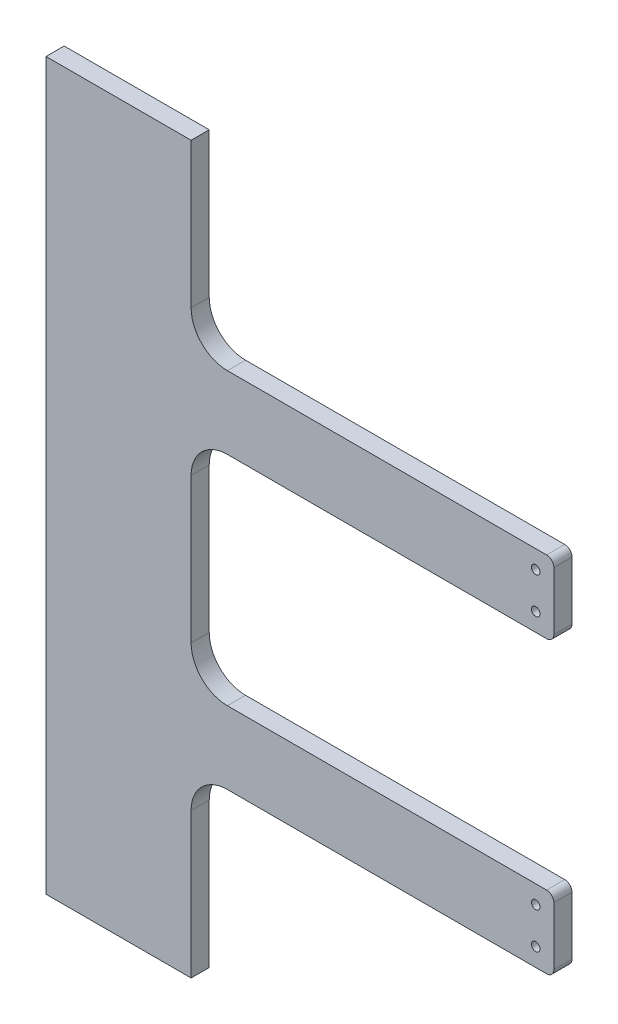
ISO-10303-21;
HEADER;
FILE_DESCRIPTION(('STEP AP214'),'2;1');
FILE_NAME('part.step','',(''),(''),'','','');
FILE_SCHEMA(('AUTOMOTIVE_DESIGN { 1 0 10303 214 1 1 1 1 }'));
ENDSEC;
DATA;
#1=APPLICATION_CONTEXT('core data for automotive mechanical design processes');
#2=APPLICATION_PROTOCOL_DEFINITION('international standard','automotive_design',2000,#1);
#3=PRODUCT_CONTEXT('',#1,'mechanical');
#4=PRODUCT('Part','Part','',(#3));
#5=PRODUCT_RELATED_PRODUCT_CATEGORY('part','',(#4));
#6=PRODUCT_DEFINITION_FORMATION('','',#4);
#7=PRODUCT_DEFINITION_CONTEXT('part definition',#1,'design');
#8=PRODUCT_DEFINITION('design','',#6,#7);
#9=PRODUCT_DEFINITION_SHAPE('','',#8);
#10=(LENGTH_UNIT() NAMED_UNIT(*) SI_UNIT(.MILLI.,.METRE.));
#11=(NAMED_UNIT(*) PLANE_ANGLE_UNIT() SI_UNIT($,.RADIAN.));
#12=(NAMED_UNIT(*) SI_UNIT($,.STERADIAN.) SOLID_ANGLE_UNIT());
#13=UNCERTAINTY_MEASURE_WITH_UNIT(LENGTH_MEASURE(1.E-05),#10,'distance_accuracy_value','');
#14=(GEOMETRIC_REPRESENTATION_CONTEXT(3) GLOBAL_UNCERTAINTY_ASSIGNED_CONTEXT((#13)) GLOBAL_UNIT_ASSIGNED_CONTEXT((#10,
#11,#12)) REPRESENTATION_CONTEXT('',''));
#15=CARTESIAN_POINT('',(0.,0.,0.));
#16=DIRECTION('',(0.,0.,1.));
#17=DIRECTION('',(1.,0.,0.));
#18=AXIS2_PLACEMENT_3D('',#15,#16,#17);
#19=CARTESIAN_POINT('',(25.4,127.,6.35));
#20=DIRECTION('',(-1.,0.,0.));
#21=DIRECTION('',(0.,-1.,0.));
#22=AXIS2_PLACEMENT_3D('',#19,#20,#21);
#23=PLANE('',#22);
#24=DIRECTION('',(0.,1.,0.));
#25=VECTOR('',#24,1.);
#26=CARTESIAN_POINT('',(25.4,127.,6.35));
#27=LINE('',#26,#25);
#28=CARTESIAN_POINT('',(25.4,76.2,6.35));
#29=VERTEX_POINT('',#28);
#30=CARTESIAN_POINT('',(25.4,127.,6.35));
#31=VERTEX_POINT('',#30);
#32=EDGE_CURVE('E180',#29,#31,#27,.T.);
#33=ORIENTED_EDGE('',*,*,#32,.F.);
#34=DIRECTION('',(0.,0.,1.));
#35=VECTOR('',#34,1.);
#36=CARTESIAN_POINT('',(25.4,76.2,6.35));
#37=LINE('',#36,#35);
#38=CARTESIAN_POINT('',(25.4,76.2,0.));
#39=VERTEX_POINT('',#38);
#40=EDGE_CURVE('E238',#29,#39,#37,.F.);
#41=ORIENTED_EDGE('',*,*,#40,.T.);
#42=DIRECTION('',(0.,1.,0.));
#43=VECTOR('',#42,1.);
#44=CARTESIAN_POINT('',(25.4,127.,0.));
#45=LINE('',#44,#43);
#46=CARTESIAN_POINT('',(25.4,127.,0.));
#47=VERTEX_POINT('',#46);
#48=EDGE_CURVE('E207',#39,#47,#45,.T.);
#49=ORIENTED_EDGE('',*,*,#48,.T.);
#50=DIRECTION('',(0.,0.,-1.));
#51=VECTOR('',#50,1.);
#52=CARTESIAN_POINT('',(25.4,127.,6.35));
#53=LINE('',#52,#51);
#54=EDGE_CURVE('E199',#31,#47,#53,.T.);
#55=ORIENTED_EDGE('',*,*,#54,.F.);
#56=EDGE_LOOP('',(#33,#41,#49,#55));
#57=FACE_BOUND('',#56,.T.);
#58=ADVANCED_FACE('F41',(#57),#23,.F.);
#59=CARTESIAN_POINT('',(25.4,-25.4,6.35));
#60=VERTEX_POINT('',#59);
#61=CARTESIAN_POINT('',(25.4,25.4,6.35));
#62=VERTEX_POINT('',#61);
#63=EDGE_CURVE('E192',#60,#62,#27,.T.);
#64=ORIENTED_EDGE('',*,*,#63,.F.);
#65=DIRECTION('',(0.,0.,1.));
#66=VECTOR('',#65,1.);
#67=CARTESIAN_POINT('',(25.4,-25.4,6.35));
#68=LINE('',#67,#66);
#69=CARTESIAN_POINT('',(25.4,-25.4,0.));
#70=VERTEX_POINT('',#69);
#71=EDGE_CURVE('E231',#60,#70,#68,.F.);
#72=ORIENTED_EDGE('',*,*,#71,.T.);
#73=CARTESIAN_POINT('',(25.4,25.4,0.));
#74=VERTEX_POINT('',#73);
#75=EDGE_CURVE('E359',#70,#74,#45,.T.);
#76=ORIENTED_EDGE('',*,*,#75,.T.);
#77=DIRECTION('',(0.,0.,1.));
#78=VECTOR('',#77,1.);
#79=CARTESIAN_POINT('',(25.4,25.4,6.35));
#80=LINE('',#79,#78);
#81=EDGE_CURVE('E227',#74,#62,#80,.T.);
#82=ORIENTED_EDGE('',*,*,#81,.T.);
#83=EDGE_LOOP('',(#64,#72,#76,#82));
#84=FACE_BOUND('',#83,.T.);
#85=ADVANCED_FACE('F483',(#84),#23,.F.);
#86=CARTESIAN_POINT('',(25.4,-127.,0.));
#87=VERTEX_POINT('',#86);
#88=CARTESIAN_POINT('',(25.4,-76.2,0.));
#89=VERTEX_POINT('',#88);
#90=EDGE_CURVE('E354',#87,#89,#45,.T.);
#91=ORIENTED_EDGE('',*,*,#90,.T.);
#92=DIRECTION('',(0.,0.,1.));
#93=VECTOR('',#92,1.);
#94=CARTESIAN_POINT('',(25.4,-76.2,6.35));
#95=LINE('',#94,#93);
#96=CARTESIAN_POINT('',(25.4,-76.2,6.35));
#97=VERTEX_POINT('',#96);
#98=EDGE_CURVE('E210',#89,#97,#95,.T.);
#99=ORIENTED_EDGE('',*,*,#98,.T.);
#100=CARTESIAN_POINT('',(25.4,-127.,6.35));
#101=VERTEX_POINT('',#100);
#102=EDGE_CURVE('E195',#101,#97,#27,.T.);
#103=ORIENTED_EDGE('',*,*,#102,.F.);
#104=DIRECTION('',(0.,0.,-1.));
#105=VECTOR('',#104,1.);
#106=CARTESIAN_POINT('',(25.4,-127.,6.35));
#107=LINE('',#106,#105);
#108=EDGE_CURVE('E353',#101,#87,#107,.T.);
#109=ORIENTED_EDGE('',*,*,#108,.T.);
#110=EDGE_LOOP('',(#91,#99,#103,#109));
#111=FACE_BOUND('',#110,.T.);
#112=ADVANCED_FACE('F383',(#111),#23,.F.);
#113=CARTESIAN_POINT('',(-25.4,127.,6.35));
#114=DIRECTION('',(0.,-1.,0.));
#115=DIRECTION('',(0.,0.,-1.));
#116=AXIS2_PLACEMENT_3D('',#113,#114,#115);
#117=PLANE('',#116);
#118=DIRECTION('',(-1.,0.,0.));
#119=VECTOR('',#118,1.);
#120=CARTESIAN_POINT('',(-25.4,127.,0.));
#121=LINE('',#120,#119);
#122=CARTESIAN_POINT('',(-25.4,127.,0.));
#123=VERTEX_POINT('',#122);
#124=EDGE_CURVE('E358',#47,#123,#121,.T.);
#125=ORIENTED_EDGE('',*,*,#124,.T.);
#126=DIRECTION('',(0.,0.,-1.));
#127=VECTOR('',#126,1.);
#128=CARTESIAN_POINT('',(-25.4,127.,6.35));
#129=LINE('',#128,#127);
#130=CARTESIAN_POINT('',(-25.4,127.,6.35));
#131=VERTEX_POINT('',#130);
#132=EDGE_CURVE('E201',#131,#123,#129,.T.);
#133=ORIENTED_EDGE('',*,*,#132,.F.);
#134=DIRECTION('',(-1.,0.,0.));
#135=VECTOR('',#134,1.);
#136=CARTESIAN_POINT('',(-25.4,127.,6.35));
#137=LINE('',#136,#135);
#138=EDGE_CURVE('E184',#31,#131,#137,.T.);
#139=ORIENTED_EDGE('',*,*,#138,.F.);
#140=ORIENTED_EDGE('',*,*,#54,.T.);
#141=EDGE_LOOP('',(#125,#133,#139,#140));
#142=FACE_BOUND('',#141,.T.);
#143=ADVANCED_FACE('F198',(#142),#117,.F.);
#144=CARTESIAN_POINT('',(-25.4,127.,6.35));
#145=DIRECTION('',(1.,0.,0.));
#146=DIRECTION('',(0.,1.,0.));
#147=AXIS2_PLACEMENT_3D('',#144,#145,#146);
#148=PLANE('',#147);
#149=DIRECTION('',(0.,-1.,0.));
#150=VECTOR('',#149,1.);
#151=CARTESIAN_POINT('',(-25.4,127.,0.));
#152=LINE('',#151,#150);
#153=CARTESIAN_POINT('',(-25.4,-127.,0.));
#154=VERTEX_POINT('',#153);
#155=EDGE_CURVE('E362',#123,#154,#152,.T.);
#156=ORIENTED_EDGE('',*,*,#155,.T.);
#157=DIRECTION('',(0.,0.,-1.));
#158=VECTOR('',#157,1.);
#159=CARTESIAN_POINT('',(-25.4,-127.,6.35));
#160=LINE('',#159,#158);
#161=CARTESIAN_POINT('',(-25.4,-127.,6.35));
#162=VERTEX_POINT('',#161);
#163=EDGE_CURVE('E217',#162,#154,#160,.T.);
#164=ORIENTED_EDGE('',*,*,#163,.F.);
#165=DIRECTION('',(0.,-1.,0.));
#166=VECTOR('',#165,1.);
#167=CARTESIAN_POINT('',(-25.4,127.,6.35));
#168=LINE('',#167,#166);
#169=EDGE_CURVE('E204',#131,#162,#168,.T.);
#170=ORIENTED_EDGE('',*,*,#169,.F.);
#171=ORIENTED_EDGE('',*,*,#132,.T.);
#172=EDGE_LOOP('',(#156,#164,#170,#171));
#173=FACE_BOUND('',#172,.T.);
#174=ADVANCED_FACE('F497',(#173),#148,.F.);
#175=CARTESIAN_POINT('',(-25.4,-127.,6.35));
#176=DIRECTION('',(0.,1.,0.));
#177=DIRECTION('',(0.,0.,1.));
#178=AXIS2_PLACEMENT_3D('',#175,#176,#177);
#179=PLANE('',#178);
#180=DIRECTION('',(1.,0.,0.));
#181=VECTOR('',#180,1.);
#182=CARTESIAN_POINT('',(-25.4,-127.,0.));
#183=LINE('',#182,#181);
#184=EDGE_CURVE('E193',#154,#87,#183,.T.);
#185=ORIENTED_EDGE('',*,*,#184,.T.);
#186=ORIENTED_EDGE('',*,*,#108,.F.);
#187=DIRECTION('',(1.,0.,0.));
#188=VECTOR('',#187,1.);
#189=CARTESIAN_POINT('',(-25.4,-127.,6.35));
#190=LINE('',#189,#188);
#191=EDGE_CURVE('E350',#162,#101,#190,.T.);
#192=ORIENTED_EDGE('',*,*,#191,.F.);
#193=ORIENTED_EDGE('',*,*,#163,.T.);
#194=EDGE_LOOP('',(#185,#186,#192,#193));
#195=FACE_BOUND('',#194,.T.);
#196=ADVANCED_FACE('F375',(#195),#179,.F.);
#197=CARTESIAN_POINT('',(0.,0.,6.35));
#198=DIRECTION('',(0.,0.,1.));
#199=DIRECTION('',(1.,0.,0.));
#200=AXIS2_PLACEMENT_3D('',#197,#198,#199);
#201=PLANE('',#200);
#202=CARTESIAN_POINT('',(146.05,57.15,6.35));
#203=DIRECTION('',(0.,0.,-1.));
#204=DIRECTION('',(-1.,0.,0.));
#205=AXIS2_PLACEMENT_3D('',#202,#203,#204);
#206=CIRCLE('',#205,1.5);
#207=CARTESIAN_POINT('',(144.55,57.15,6.35));
#208=VERTEX_POINT('',#207);
#209=EDGE_CURVE('E409',#208,#208,#206,.T.);
#210=ORIENTED_EDGE('',*,*,#209,.T.);
#211=EDGE_LOOP('',(#210));
#212=FACE_BOUND('',#211,.T.);
#213=CARTESIAN_POINT('',(146.05,44.45,6.35));
#214=DIRECTION('',(0.,0.,-1.));
#215=DIRECTION('',(-1.,0.,0.));
#216=AXIS2_PLACEMENT_3D('',#213,#214,#215);
#217=CIRCLE('',#216,1.5);
#218=CARTESIAN_POINT('',(144.55,44.45,6.35));
#219=VERTEX_POINT('',#218);
#220=EDGE_CURVE('E439',#219,#219,#217,.T.);
#221=ORIENTED_EDGE('',*,*,#220,.T.);
#222=EDGE_LOOP('',(#221));
#223=FACE_BOUND('',#222,.T.);
#224=CARTESIAN_POINT('',(146.05,-44.45,6.35));
#225=DIRECTION('',(0.,0.,-1.));
#226=DIRECTION('',(-1.,0.,0.));
#227=AXIS2_PLACEMENT_3D('',#224,#225,#226);
#228=CIRCLE('',#227,1.5);
#229=CARTESIAN_POINT('',(144.55,-44.45,6.35));
#230=VERTEX_POINT('',#229);
#231=EDGE_CURVE('E431',#230,#230,#228,.T.);
#232=ORIENTED_EDGE('',*,*,#231,.T.);
#233=EDGE_LOOP('',(#232));
#234=FACE_BOUND('',#233,.T.);
#235=CARTESIAN_POINT('',(146.05,-57.15,6.35));
#236=DIRECTION('',(0.,0.,-1.));
#237=DIRECTION('',(-1.,0.,0.));
#238=AXIS2_PLACEMENT_3D('',#235,#236,#237);
#239=CIRCLE('',#238,1.5);
#240=CARTESIAN_POINT('',(144.55,-57.15,6.35));
#241=VERTEX_POINT('',#240);
#242=EDGE_CURVE('E423',#241,#241,#239,.T.);
#243=ORIENTED_EDGE('',*,*,#242,.T.);
#244=EDGE_LOOP('',(#243));
#245=FACE_BOUND('',#244,.T.);
#246=DIRECTION('',(0.,1.,0.));
#247=VECTOR('',#246,1.);
#248=CARTESIAN_POINT('',(152.4,38.1,6.35));
#249=LINE('',#248,#247);
#250=CARTESIAN_POINT('',(152.4,40.64,6.35));
#251=VERTEX_POINT('',#250);
#252=CARTESIAN_POINT('',(152.4,60.96,6.35));
#253=VERTEX_POINT('',#252);
#254=EDGE_CURVE('E402',#251,#253,#249,.T.);
#255=ORIENTED_EDGE('',*,*,#254,.T.);
#256=CARTESIAN_POINT('',(149.86,60.96,6.35));
#257=DIRECTION('',(0.,0.,1.));
#258=DIRECTION('',(1.,0.,0.));
#259=AXIS2_PLACEMENT_3D('',#256,#257,#258);
#260=CIRCLE('',#259,2.54);
#261=CARTESIAN_POINT('',(149.86,63.5,6.35));
#262=VERTEX_POINT('',#261);
#263=EDGE_CURVE('E285',#253,#262,#260,.T.);
#264=ORIENTED_EDGE('',*,*,#263,.T.);
#265=DIRECTION('',(-1.,0.,0.));
#266=VECTOR('',#265,1.);
#267=CARTESIAN_POINT('',(25.4,63.5,6.35));
#268=LINE('',#267,#266);
#269=CARTESIAN_POINT('',(38.1,63.5,6.35));
#270=VERTEX_POINT('',#269);
#271=EDGE_CURVE('E398',#262,#270,#268,.T.);
#272=ORIENTED_EDGE('',*,*,#271,.T.);
#273=CARTESIAN_POINT('',(38.1,76.2,6.35));
#274=DIRECTION('',(0.,0.,1.));
#275=DIRECTION('',(1.,0.,0.));
#276=AXIS2_PLACEMENT_3D('',#273,#274,#275);
#277=CIRCLE('',#276,12.7);
#278=EDGE_CURVE('E187',#270,#29,#277,.F.);
#279=ORIENTED_EDGE('',*,*,#278,.T.);
#280=ORIENTED_EDGE('',*,*,#32,.T.);
#281=ORIENTED_EDGE('',*,*,#138,.T.);
#282=ORIENTED_EDGE('',*,*,#169,.T.);
#283=ORIENTED_EDGE('',*,*,#191,.T.);
#284=ORIENTED_EDGE('',*,*,#102,.T.);
#285=CARTESIAN_POINT('',(38.1,-76.2,6.35));
#286=DIRECTION('',(0.,0.,1.));
#287=DIRECTION('',(1.,0.,0.));
#288=AXIS2_PLACEMENT_3D('',#285,#286,#287);
#289=CIRCLE('',#288,12.7);
#290=CARTESIAN_POINT('',(38.1,-63.5,6.35));
#291=VERTEX_POINT('',#290);
#292=EDGE_CURVE('E244',#97,#291,#289,.F.);
#293=ORIENTED_EDGE('',*,*,#292,.T.);
#294=DIRECTION('',(1.,0.,0.));
#295=VECTOR('',#294,1.);
#296=CARTESIAN_POINT('',(25.4,-63.5,6.35));
#297=LINE('',#296,#295);
#298=CARTESIAN_POINT('',(149.86,-63.5,6.35));
#299=VERTEX_POINT('',#298);
#300=EDGE_CURVE('E337',#291,#299,#297,.T.);
#301=ORIENTED_EDGE('',*,*,#300,.T.);
#302=CARTESIAN_POINT('',(149.86,-60.96,6.35));
#303=DIRECTION('',(0.,0.,1.));
#304=DIRECTION('',(1.,0.,0.));
#305=AXIS2_PLACEMENT_3D('',#302,#303,#304);
#306=CIRCLE('',#305,2.54);
#307=CARTESIAN_POINT('',(152.4,-60.96,6.35));
#308=VERTEX_POINT('',#307);
#309=EDGE_CURVE('E276',#299,#308,#306,.T.);
#310=ORIENTED_EDGE('',*,*,#309,.T.);
#311=DIRECTION('',(0.,1.,0.));
#312=VECTOR('',#311,1.);
#313=CARTESIAN_POINT('',(152.4,-63.5,6.35));
#314=LINE('',#313,#312);
#315=CARTESIAN_POINT('',(152.4,-40.64,6.35));
#316=VERTEX_POINT('',#315);
#317=EDGE_CURVE('E333',#308,#316,#314,.T.);
#318=ORIENTED_EDGE('',*,*,#317,.T.);
#319=CARTESIAN_POINT('',(149.86,-40.64,6.35));
#320=DIRECTION('',(0.,0.,1.));
#321=DIRECTION('',(1.,0.,0.));
#322=AXIS2_PLACEMENT_3D('',#319,#320,#321);
#323=CIRCLE('',#322,2.54);
#324=CARTESIAN_POINT('',(149.86,-38.1,6.35));
#325=VERTEX_POINT('',#324);
#326=EDGE_CURVE('E279',#316,#325,#323,.T.);
#327=ORIENTED_EDGE('',*,*,#326,.T.);
#328=DIRECTION('',(-1.,0.,0.));
#329=VECTOR('',#328,1.);
#330=CARTESIAN_POINT('',(25.4,-38.1,6.35));
#331=LINE('',#330,#329);
#332=CARTESIAN_POINT('',(38.1,-38.1,6.35));
#333=VERTEX_POINT('',#332);
#334=EDGE_CURVE('E317',#325,#333,#331,.T.);
#335=ORIENTED_EDGE('',*,*,#334,.T.);
#336=CARTESIAN_POINT('',(38.1,-25.4,6.35));
#337=DIRECTION('',(0.,0.,1.));
#338=DIRECTION('',(1.,0.,0.));
#339=AXIS2_PLACEMENT_3D('',#336,#337,#338);
#340=CIRCLE('',#339,12.7);
#341=EDGE_CURVE('E250',#333,#60,#340,.F.);
#342=ORIENTED_EDGE('',*,*,#341,.T.);
#343=ORIENTED_EDGE('',*,*,#63,.T.);
#344=CARTESIAN_POINT('',(38.1,25.4,6.35));
#345=DIRECTION('',(0.,0.,1.));
#346=DIRECTION('',(1.,0.,0.));
#347=AXIS2_PLACEMENT_3D('',#344,#345,#346);
#348=CIRCLE('',#347,12.7);
#349=CARTESIAN_POINT('',(38.1,38.1,6.35));
#350=VERTEX_POINT('',#349);
#351=EDGE_CURVE('E263',#62,#350,#348,.F.);
#352=ORIENTED_EDGE('',*,*,#351,.T.);
#353=DIRECTION('',(1.,0.,0.));
#354=VECTOR('',#353,1.);
#355=CARTESIAN_POINT('',(25.4,38.1,6.35));
#356=LINE('',#355,#354);
#357=CARTESIAN_POINT('',(149.86,38.1,6.35));
#358=VERTEX_POINT('',#357);
#359=EDGE_CURVE('E405',#350,#358,#356,.T.);
#360=ORIENTED_EDGE('',*,*,#359,.T.);
#361=CARTESIAN_POINT('',(149.86,40.64,6.35));
#362=DIRECTION('',(0.,0.,1.));
#363=DIRECTION('',(1.,0.,0.));
#364=AXIS2_PLACEMENT_3D('',#361,#362,#363);
#365=CIRCLE('',#364,2.54);
#366=EDGE_CURVE('E282',#358,#251,#365,.T.);
#367=ORIENTED_EDGE('',*,*,#366,.T.);
#368=EDGE_LOOP('',(#255,#264,#272,#279,#280,#281,#282,#283,#284,#293,#301,#310,#318,#327,#335,
#342,#343,#352,#360,#367));
#369=FACE_BOUND('',#368,.T.);
#370=ADVANCED_FACE('F183',(#212,#223,#234,#245,#369),#201,.T.);
#371=CARTESIAN_POINT('',(0.,0.,0.));
#372=DIRECTION('',(0.,0.,1.));
#373=DIRECTION('',(1.,0.,0.));
#374=AXIS2_PLACEMENT_3D('',#371,#372,#373);
#375=PLANE('',#374);
#376=CARTESIAN_POINT('',(146.05,57.15,0.));
#377=DIRECTION('',(0.,0.,-1.));
#378=DIRECTION('',(-1.,0.,0.));
#379=AXIS2_PLACEMENT_3D('',#376,#377,#378);
#380=CIRCLE('',#379,1.5);
#381=CARTESIAN_POINT('',(144.55,57.15,0.));
#382=VERTEX_POINT('',#381);
#383=EDGE_CURVE('E443',#382,#382,#380,.T.);
#384=ORIENTED_EDGE('',*,*,#383,.F.);
#385=EDGE_LOOP('',(#384));
#386=FACE_BOUND('',#385,.T.);
#387=CARTESIAN_POINT('',(146.05,44.45,0.));
#388=DIRECTION('',(0.,0.,-1.));
#389=DIRECTION('',(-1.,0.,0.));
#390=AXIS2_PLACEMENT_3D('',#387,#388,#389);
#391=CIRCLE('',#390,1.5);
#392=CARTESIAN_POINT('',(144.55,44.45,0.));
#393=VERTEX_POINT('',#392);
#394=EDGE_CURVE('E435',#393,#393,#391,.T.);
#395=ORIENTED_EDGE('',*,*,#394,.F.);
#396=EDGE_LOOP('',(#395));
#397=FACE_BOUND('',#396,.T.);
#398=CARTESIAN_POINT('',(146.05,-44.45,0.));
#399=DIRECTION('',(0.,0.,-1.));
#400=DIRECTION('',(-1.,0.,0.));
#401=AXIS2_PLACEMENT_3D('',#398,#399,#400);
#402=CIRCLE('',#401,1.5);
#403=CARTESIAN_POINT('',(144.55,-44.45,0.));
#404=VERTEX_POINT('',#403);
#405=EDGE_CURVE('E427',#404,#404,#402,.T.);
#406=ORIENTED_EDGE('',*,*,#405,.F.);
#407=EDGE_LOOP('',(#406));
#408=FACE_BOUND('',#407,.T.);
#409=CARTESIAN_POINT('',(146.05,-57.15,0.));
#410=DIRECTION('',(0.,0.,-1.));
#411=DIRECTION('',(-1.,0.,0.));
#412=AXIS2_PLACEMENT_3D('',#409,#410,#411);
#413=CIRCLE('',#412,1.5);
#414=CARTESIAN_POINT('',(144.55,-57.15,0.));
#415=VERTEX_POINT('',#414);
#416=EDGE_CURVE('E419',#415,#415,#413,.T.);
#417=ORIENTED_EDGE('',*,*,#416,.F.);
#418=EDGE_LOOP('',(#417));
#419=FACE_BOUND('',#418,.T.);
#420=DIRECTION('',(-1.,0.,0.));
#421=VECTOR('',#420,1.);
#422=CARTESIAN_POINT('',(25.4,63.5,0.));
#423=LINE('',#422,#421);
#424=CARTESIAN_POINT('',(149.86,63.5,0.));
#425=VERTEX_POINT('',#424);
#426=CARTESIAN_POINT('',(38.1,63.5,0.));
#427=VERTEX_POINT('',#426);
#428=EDGE_CURVE('E343',#425,#427,#423,.T.);
#429=ORIENTED_EDGE('',*,*,#428,.F.);
#430=CARTESIAN_POINT('',(149.86,60.96,0.));
#431=DIRECTION('',(0.,0.,1.));
#432=DIRECTION('',(1.,0.,0.));
#433=AXIS2_PLACEMENT_3D('',#430,#431,#432);
#434=CIRCLE('',#433,2.54);
#435=CARTESIAN_POINT('',(152.4,60.96,0.));
#436=VERTEX_POINT('',#435);
#437=EDGE_CURVE('E298',#425,#436,#434,.F.);
#438=ORIENTED_EDGE('',*,*,#437,.T.);
#439=DIRECTION('',(0.,1.,0.));
#440=VECTOR('',#439,1.);
#441=CARTESIAN_POINT('',(152.4,38.1,0.));
#442=LINE('',#441,#440);
#443=CARTESIAN_POINT('',(152.4,40.64,0.));
#444=VERTEX_POINT('',#443);
#445=EDGE_CURVE('E412',#444,#436,#442,.T.);
#446=ORIENTED_EDGE('',*,*,#445,.F.);
#447=CARTESIAN_POINT('',(149.86,40.64,0.));
#448=DIRECTION('',(0.,0.,1.));
#449=DIRECTION('',(1.,0.,0.));
#450=AXIS2_PLACEMENT_3D('',#447,#448,#449);
#451=CIRCLE('',#450,2.54);
#452=CARTESIAN_POINT('',(149.86,38.1,0.));
#453=VERTEX_POINT('',#452);
#454=EDGE_CURVE('E295',#444,#453,#451,.F.);
#455=ORIENTED_EDGE('',*,*,#454,.T.);
#456=DIRECTION('',(1.,0.,0.));
#457=VECTOR('',#456,1.);
#458=CARTESIAN_POINT('',(25.4,38.1,0.));
#459=LINE('',#458,#457);
#460=CARTESIAN_POINT('',(38.1,38.1,0.));
#461=VERTEX_POINT('',#460);
#462=EDGE_CURVE('E401',#461,#453,#459,.T.);
#463=ORIENTED_EDGE('',*,*,#462,.F.);
#464=CARTESIAN_POINT('',(38.1,25.4,0.));
#465=DIRECTION('',(0.,0.,1.));
#466=DIRECTION('',(1.,0.,0.));
#467=AXIS2_PLACEMENT_3D('',#464,#465,#466);
#468=CIRCLE('',#467,12.7);
#469=EDGE_CURVE('E266',#461,#74,#468,.T.);
#470=ORIENTED_EDGE('',*,*,#469,.T.);
#471=ORIENTED_EDGE('',*,*,#75,.F.);
#472=CARTESIAN_POINT('',(38.1,-25.4,0.));
#473=DIRECTION('',(0.,0.,1.));
#474=DIRECTION('',(1.,0.,0.));
#475=AXIS2_PLACEMENT_3D('',#472,#473,#474);
#476=CIRCLE('',#475,12.7);
#477=CARTESIAN_POINT('',(38.1,-38.1,0.));
#478=VERTEX_POINT('',#477);
#479=EDGE_CURVE('E253',#70,#478,#476,.T.);
#480=ORIENTED_EDGE('',*,*,#479,.T.);
#481=DIRECTION('',(-1.,0.,0.));
#482=VECTOR('',#481,1.);
#483=CARTESIAN_POINT('',(25.4,-38.1,0.));
#484=LINE('',#483,#482);
#485=CARTESIAN_POINT('',(149.86,-38.1,0.));
#486=VERTEX_POINT('',#485);
#487=EDGE_CURVE('E316',#486,#478,#484,.T.);
#488=ORIENTED_EDGE('',*,*,#487,.F.);
#489=CARTESIAN_POINT('',(149.86,-40.64,0.));
#490=DIRECTION('',(0.,0.,1.));
#491=DIRECTION('',(1.,0.,0.));
#492=AXIS2_PLACEMENT_3D('',#489,#490,#491);
#493=CIRCLE('',#492,2.54);
#494=CARTESIAN_POINT('',(152.4,-40.64,0.));
#495=VERTEX_POINT('',#494);
#496=EDGE_CURVE('E63',#486,#495,#493,.F.);
#497=ORIENTED_EDGE('',*,*,#496,.T.);
#498=DIRECTION('',(0.,1.,0.));
#499=VECTOR('',#498,1.);
#500=CARTESIAN_POINT('',(152.4,-63.5,0.));
#501=LINE('',#500,#499);
#502=CARTESIAN_POINT('',(152.4,-60.96,0.));
#503=VERTEX_POINT('',#502);
#504=EDGE_CURVE('E325',#503,#495,#501,.T.);
#505=ORIENTED_EDGE('',*,*,#504,.F.);
#506=CARTESIAN_POINT('',(149.86,-60.96,0.));
#507=DIRECTION('',(0.,0.,1.));
#508=DIRECTION('',(1.,0.,0.));
#509=AXIS2_PLACEMENT_3D('',#506,#507,#508);
#510=CIRCLE('',#509,2.54);
#511=CARTESIAN_POINT('',(149.86,-63.5,0.));
#512=VERTEX_POINT('',#511);
#513=EDGE_CURVE('E57',#503,#512,#510,.F.);
#514=ORIENTED_EDGE('',*,*,#513,.T.);
#515=DIRECTION('',(1.,0.,0.));
#516=VECTOR('',#515,1.);
#517=CARTESIAN_POINT('',(25.4,-63.5,0.));
#518=LINE('',#517,#516);
#519=CARTESIAN_POINT('',(38.1,-63.5,0.));
#520=VERTEX_POINT('',#519);
#521=EDGE_CURVE('E341',#520,#512,#518,.T.);
#522=ORIENTED_EDGE('',*,*,#521,.F.);
#523=CARTESIAN_POINT('',(38.1,-76.2,0.));
#524=DIRECTION('',(0.,0.,1.));
#525=DIRECTION('',(1.,0.,0.));
#526=AXIS2_PLACEMENT_3D('',#523,#524,#525);
#527=CIRCLE('',#526,12.7);
#528=EDGE_CURVE('E247',#520,#89,#527,.T.);
#529=ORIENTED_EDGE('',*,*,#528,.T.);
#530=ORIENTED_EDGE('',*,*,#90,.F.);
#531=ORIENTED_EDGE('',*,*,#184,.F.);
#532=ORIENTED_EDGE('',*,*,#155,.F.);
#533=ORIENTED_EDGE('',*,*,#124,.F.);
#534=ORIENTED_EDGE('',*,*,#48,.F.);
#535=CARTESIAN_POINT('',(38.1,76.2,0.));
#536=DIRECTION('',(0.,0.,1.));
#537=DIRECTION('',(1.,0.,0.));
#538=AXIS2_PLACEMENT_3D('',#535,#536,#537);
#539=CIRCLE('',#538,12.7);
#540=EDGE_CURVE('E259',#39,#427,#539,.T.);
#541=ORIENTED_EDGE('',*,*,#540,.T.);
#542=EDGE_LOOP('',(#429,#438,#446,#455,#463,#470,#471,#480,#488,#497,#505,#514,#522,#529,#530,
#531,#532,#533,#534,#541));
#543=FACE_BOUND('',#542,.T.);
#544=ADVANCED_FACE('F320',(#386,#397,#408,#419,#543),#375,.F.);
#545=CARTESIAN_POINT('',(25.4,-38.1,0.));
#546=DIRECTION('',(0.,1.,0.));
#547=DIRECTION('',(0.,0.,1.));
#548=AXIS2_PLACEMENT_3D('',#545,#546,#547);
#549=PLANE('',#548);
#550=ORIENTED_EDGE('',*,*,#334,.F.);
#551=DIRECTION('',(0.,0.,1.));
#552=VECTOR('',#551,1.);
#553=CARTESIAN_POINT('',(149.86,-38.1,0.));
#554=LINE('',#553,#552);
#555=EDGE_CURVE('E50',#325,#486,#554,.F.);
#556=ORIENTED_EDGE('',*,*,#555,.T.);
#557=ORIENTED_EDGE('',*,*,#487,.T.);
#558=DIRECTION('',(0.,0.,1.));
#559=VECTOR('',#558,1.);
#560=CARTESIAN_POINT('',(38.1,-38.1,0.));
#561=LINE('',#560,#559);
#562=EDGE_CURVE('E223',#478,#333,#561,.T.);
#563=ORIENTED_EDGE('',*,*,#562,.T.);
#564=EDGE_LOOP('',(#550,#556,#557,#563));
#565=FACE_BOUND('',#564,.T.);
#566=ADVANCED_FACE('F315',(#565),#549,.T.);
#567=CARTESIAN_POINT('',(152.4,-63.5,0.));
#568=DIRECTION('',(1.,0.,0.));
#569=DIRECTION('',(0.,0.,-1.));
#570=AXIS2_PLACEMENT_3D('',#567,#568,#569);
#571=PLANE('',#570);
#572=ORIENTED_EDGE('',*,*,#504,.T.);
#573=DIRECTION('',(0.,0.,1.));
#574=VECTOR('',#573,1.);
#575=CARTESIAN_POINT('',(152.4,-40.64,0.));
#576=LINE('',#575,#574);
#577=EDGE_CURVE('E308',#495,#316,#576,.T.);
#578=ORIENTED_EDGE('',*,*,#577,.T.);
#579=ORIENTED_EDGE('',*,*,#317,.F.);
#580=DIRECTION('',(0.,0.,1.));
#581=VECTOR('',#580,1.);
#582=CARTESIAN_POINT('',(152.4,-60.96,0.));
#583=LINE('',#582,#581);
#584=EDGE_CURVE('E305',#308,#503,#583,.F.);
#585=ORIENTED_EDGE('',*,*,#584,.T.);
#586=EDGE_LOOP('',(#572,#578,#579,#585));
#587=FACE_BOUND('',#586,.T.);
#588=ADVANCED_FACE('F332',(#587),#571,.T.);
#589=CARTESIAN_POINT('',(25.4,-63.5,0.));
#590=DIRECTION('',(0.,-1.,0.));
#591=DIRECTION('',(0.,0.,-1.));
#592=AXIS2_PLACEMENT_3D('',#589,#590,#591);
#593=PLANE('',#592);
#594=ORIENTED_EDGE('',*,*,#521,.T.);
#595=DIRECTION('',(0.,0.,1.));
#596=VECTOR('',#595,1.);
#597=CARTESIAN_POINT('',(149.86,-63.5,0.));
#598=LINE('',#597,#596);
#599=EDGE_CURVE('E11',#512,#299,#598,.T.);
#600=ORIENTED_EDGE('',*,*,#599,.T.);
#601=ORIENTED_EDGE('',*,*,#300,.F.);
#602=DIRECTION('',(0.,0.,1.));
#603=VECTOR('',#602,1.);
#604=CARTESIAN_POINT('',(38.1,-63.5,0.));
#605=LINE('',#604,#603);
#606=EDGE_CURVE('E215',#291,#520,#605,.F.);
#607=ORIENTED_EDGE('',*,*,#606,.T.);
#608=EDGE_LOOP('',(#594,#600,#601,#607));
#609=FACE_BOUND('',#608,.T.);
#610=ADVANCED_FACE('F390',(#609),#593,.T.);
#611=CARTESIAN_POINT('',(25.4,63.5,0.));
#612=DIRECTION('',(0.,1.,0.));
#613=DIRECTION('',(0.,0.,1.));
#614=AXIS2_PLACEMENT_3D('',#611,#612,#613);
#615=PLANE('',#614);
#616=ORIENTED_EDGE('',*,*,#271,.F.);
#617=DIRECTION('',(0.,0.,1.));
#618=VECTOR('',#617,1.);
#619=CARTESIAN_POINT('',(149.86,63.5,0.));
#620=LINE('',#619,#618);
#621=EDGE_CURVE('E288',#262,#425,#620,.F.);
#622=ORIENTED_EDGE('',*,*,#621,.T.);
#623=ORIENTED_EDGE('',*,*,#428,.T.);
#624=DIRECTION('',(0.,0.,1.));
#625=VECTOR('',#624,1.);
#626=CARTESIAN_POINT('',(38.1,63.5,0.));
#627=LINE('',#626,#625);
#628=EDGE_CURVE('E234',#427,#270,#627,.T.);
#629=ORIENTED_EDGE('',*,*,#628,.T.);
#630=EDGE_LOOP('',(#616,#622,#623,#629));
#631=FACE_BOUND('',#630,.T.);
#632=ADVANCED_FACE('F509',(#631),#615,.T.);
#633=CARTESIAN_POINT('',(152.4,38.1,0.));
#634=DIRECTION('',(1.,0.,0.));
#635=DIRECTION('',(0.,0.,-1.));
#636=AXIS2_PLACEMENT_3D('',#633,#634,#635);
#637=PLANE('',#636);
#638=ORIENTED_EDGE('',*,*,#445,.T.);
#639=DIRECTION('',(0.,0.,1.));
#640=VECTOR('',#639,1.);
#641=CARTESIAN_POINT('',(152.4,60.96,0.));
#642=LINE('',#641,#640);
#643=EDGE_CURVE('E272',#436,#253,#642,.T.);
#644=ORIENTED_EDGE('',*,*,#643,.T.);
#645=ORIENTED_EDGE('',*,*,#254,.F.);
#646=DIRECTION('',(0.,0.,1.));
#647=VECTOR('',#646,1.);
#648=CARTESIAN_POINT('',(152.4,40.64,0.));
#649=LINE('',#648,#647);
#650=EDGE_CURVE('E269',#251,#444,#649,.F.);
#651=ORIENTED_EDGE('',*,*,#650,.T.);
#652=EDGE_LOOP('',(#638,#644,#645,#651));
#653=FACE_BOUND('',#652,.T.);
#654=ADVANCED_FACE('F517',(#653),#637,.T.);
#655=CARTESIAN_POINT('',(25.4,38.1,0.));
#656=DIRECTION('',(0.,-1.,0.));
#657=DIRECTION('',(1.,0.,0.));
#658=AXIS2_PLACEMENT_3D('',#655,#656,#657);
#659=PLANE('',#658);
#660=ORIENTED_EDGE('',*,*,#462,.T.);
#661=DIRECTION('',(0.,0.,1.));
#662=VECTOR('',#661,1.);
#663=CARTESIAN_POINT('',(149.86,38.1,0.));
#664=LINE('',#663,#662);
#665=EDGE_CURVE('E301',#453,#358,#664,.T.);
#666=ORIENTED_EDGE('',*,*,#665,.T.);
#667=ORIENTED_EDGE('',*,*,#359,.F.);
#668=DIRECTION('',(0.,0.,1.));
#669=VECTOR('',#668,1.);
#670=CARTESIAN_POINT('',(38.1,38.1,0.));
#671=LINE('',#670,#669);
#672=EDGE_CURVE('E241',#350,#461,#671,.F.);
#673=ORIENTED_EDGE('',*,*,#672,.T.);
#674=EDGE_LOOP('',(#660,#666,#667,#673));
#675=FACE_BOUND('',#674,.T.);
#676=ADVANCED_FACE('F514',(#675),#659,.T.);
#677=CARTESIAN_POINT('',(38.1,-76.2,6.35));
#678=DIRECTION('',(0.,0.,1.));
#679=DIRECTION('',(1.,0.,0.));
#680=AXIS2_PLACEMENT_3D('',#677,#678,#679);
#681=CYLINDRICAL_SURFACE('',#680,12.7);
#682=ORIENTED_EDGE('',*,*,#528,.F.);
#683=ORIENTED_EDGE('',*,*,#606,.F.);
#684=ORIENTED_EDGE('',*,*,#292,.F.);
#685=ORIENTED_EDGE('',*,*,#98,.F.);
#686=EDGE_LOOP('',(#682,#683,#684,#685));
#687=FACE_BOUND('',#686,.T.);
#688=ADVANCED_FACE('F386',(#687),#681,.F.);
#689=CARTESIAN_POINT('',(38.1,-25.4,0.));
#690=DIRECTION('',(0.,0.,1.));
#691=DIRECTION('',(1.,0.,0.));
#692=AXIS2_PLACEMENT_3D('',#689,#690,#691);
#693=CYLINDRICAL_SURFACE('',#692,12.7);
#694=ORIENTED_EDGE('',*,*,#479,.F.);
#695=ORIENTED_EDGE('',*,*,#71,.F.);
#696=ORIENTED_EDGE('',*,*,#341,.F.);
#697=ORIENTED_EDGE('',*,*,#562,.F.);
#698=EDGE_LOOP('',(#694,#695,#696,#697));
#699=FACE_BOUND('',#698,.T.);
#700=ADVANCED_FACE('F555',(#699),#693,.F.);
#701=CARTESIAN_POINT('',(38.1,76.2,0.));
#702=DIRECTION('',(0.,0.,1.));
#703=DIRECTION('',(1.,0.,0.));
#704=AXIS2_PLACEMENT_3D('',#701,#702,#703);
#705=CYLINDRICAL_SURFACE('',#704,12.7);
#706=ORIENTED_EDGE('',*,*,#540,.F.);
#707=ORIENTED_EDGE('',*,*,#40,.F.);
#708=ORIENTED_EDGE('',*,*,#278,.F.);
#709=ORIENTED_EDGE('',*,*,#628,.F.);
#710=EDGE_LOOP('',(#706,#707,#708,#709));
#711=FACE_BOUND('',#710,.T.);
#712=ADVANCED_FACE('F557',(#711),#705,.F.);
#713=CARTESIAN_POINT('',(38.1,25.4,6.35));
#714=DIRECTION('',(0.,0.,1.));
#715=DIRECTION('',(1.,0.,0.));
#716=AXIS2_PLACEMENT_3D('',#713,#714,#715);
#717=CYLINDRICAL_SURFACE('',#716,12.7);
#718=ORIENTED_EDGE('',*,*,#469,.F.);
#719=ORIENTED_EDGE('',*,*,#672,.F.);
#720=ORIENTED_EDGE('',*,*,#351,.F.);
#721=ORIENTED_EDGE('',*,*,#81,.F.);
#722=EDGE_LOOP('',(#718,#719,#720,#721));
#723=FACE_BOUND('',#722,.T.);
#724=ADVANCED_FACE('F544',(#723),#717,.F.);
#725=CARTESIAN_POINT('',(149.86,60.96,0.));
#726=DIRECTION('',(0.,0.,1.));
#727=DIRECTION('',(1.,0.,0.));
#728=AXIS2_PLACEMENT_3D('',#725,#726,#727);
#729=CYLINDRICAL_SURFACE('',#728,2.54);
#730=ORIENTED_EDGE('',*,*,#437,.F.);
#731=ORIENTED_EDGE('',*,*,#621,.F.);
#732=ORIENTED_EDGE('',*,*,#263,.F.);
#733=ORIENTED_EDGE('',*,*,#643,.F.);
#734=EDGE_LOOP('',(#730,#731,#732,#733));
#735=FACE_BOUND('',#734,.T.);
#736=ADVANCED_FACE('F530',(#735),#729,.T.);
#737=CARTESIAN_POINT('',(149.86,40.64,0.));
#738=DIRECTION('',(0.,0.,1.));
#739=DIRECTION('',(1.,0.,0.));
#740=AXIS2_PLACEMENT_3D('',#737,#738,#739);
#741=CYLINDRICAL_SURFACE('',#740,2.54);
#742=ORIENTED_EDGE('',*,*,#454,.F.);
#743=ORIENTED_EDGE('',*,*,#650,.F.);
#744=ORIENTED_EDGE('',*,*,#366,.F.);
#745=ORIENTED_EDGE('',*,*,#665,.F.);
#746=EDGE_LOOP('',(#742,#743,#744,#745));
#747=FACE_BOUND('',#746,.T.);
#748=ADVANCED_FACE('F537',(#747),#741,.T.);
#749=CARTESIAN_POINT('',(149.86,-40.64,0.));
#750=DIRECTION('',(0.,0.,1.));
#751=DIRECTION('',(1.,0.,0.));
#752=AXIS2_PLACEMENT_3D('',#749,#750,#751);
#753=CYLINDRICAL_SURFACE('',#752,2.54);
#754=ORIENTED_EDGE('',*,*,#496,.F.);
#755=ORIENTED_EDGE('',*,*,#555,.F.);
#756=ORIENTED_EDGE('',*,*,#326,.F.);
#757=ORIENTED_EDGE('',*,*,#577,.F.);
#758=EDGE_LOOP('',(#754,#755,#756,#757));
#759=FACE_BOUND('',#758,.T.);
#760=ADVANCED_FACE('F328',(#759),#753,.T.);
#761=CARTESIAN_POINT('',(149.86,-60.96,0.));
#762=DIRECTION('',(0.,0.,1.));
#763=DIRECTION('',(1.,0.,0.));
#764=AXIS2_PLACEMENT_3D('',#761,#762,#763);
#765=CYLINDRICAL_SURFACE('',#764,2.54);
#766=ORIENTED_EDGE('',*,*,#513,.F.);
#767=ORIENTED_EDGE('',*,*,#584,.F.);
#768=ORIENTED_EDGE('',*,*,#309,.F.);
#769=ORIENTED_EDGE('',*,*,#599,.F.);
#770=EDGE_LOOP('',(#766,#767,#768,#769));
#771=FACE_BOUND('',#770,.T.);
#772=ADVANCED_FACE('F43',(#771),#765,.T.);
#773=CARTESIAN_POINT('',(146.05,-57.15,6.35));
#774=DIRECTION('',(0.,0.,-1.));
#775=DIRECTION('',(-1.,0.,0.));
#776=AXIS2_PLACEMENT_3D('',#773,#774,#775);
#777=CYLINDRICAL_SURFACE('',#776,1.5);
#778=ORIENTED_EDGE('',*,*,#242,.F.);
#779=EDGE_LOOP('',(#778));
#780=FACE_BOUND('',#779,.T.);
#781=ORIENTED_EDGE('',*,*,#416,.T.);
#782=EDGE_LOOP('',(#781));
#783=FACE_BOUND('',#782,.T.);
#784=ADVANCED_FACE('F469',(#780,#783),#777,.F.);
#785=CARTESIAN_POINT('',(146.05,-44.45,6.35));
#786=DIRECTION('',(0.,0.,-1.));
#787=DIRECTION('',(-1.,0.,0.));
#788=AXIS2_PLACEMENT_3D('',#785,#786,#787);
#789=CYLINDRICAL_SURFACE('',#788,1.5);
#790=ORIENTED_EDGE('',*,*,#231,.F.);
#791=EDGE_LOOP('',(#790));
#792=FACE_BOUND('',#791,.T.);
#793=ORIENTED_EDGE('',*,*,#405,.T.);
#794=EDGE_LOOP('',(#793));
#795=FACE_BOUND('',#794,.T.);
#796=ADVANCED_FACE('F471',(#792,#795),#789,.F.);
#797=CARTESIAN_POINT('',(146.05,44.45,6.35));
#798=DIRECTION('',(0.,0.,-1.));
#799=DIRECTION('',(-1.,0.,0.));
#800=AXIS2_PLACEMENT_3D('',#797,#798,#799);
#801=CYLINDRICAL_SURFACE('',#800,1.5);
#802=ORIENTED_EDGE('',*,*,#220,.F.);
#803=EDGE_LOOP('',(#802));
#804=FACE_BOUND('',#803,.T.);
#805=ORIENTED_EDGE('',*,*,#394,.T.);
#806=EDGE_LOOP('',(#805));
#807=FACE_BOUND('',#806,.T.);
#808=ADVANCED_FACE('F456',(#804,#807),#801,.F.);
#809=CARTESIAN_POINT('',(146.05,57.15,6.35));
#810=DIRECTION('',(0.,0.,-1.));
#811=DIRECTION('',(-1.,0.,0.));
#812=AXIS2_PLACEMENT_3D('',#809,#810,#811);
#813=CYLINDRICAL_SURFACE('',#812,1.5);
#814=ORIENTED_EDGE('',*,*,#209,.F.);
#815=EDGE_LOOP('',(#814));
#816=FACE_BOUND('',#815,.T.);
#817=ORIENTED_EDGE('',*,*,#383,.T.);
#818=EDGE_LOOP('',(#817));
#819=FACE_BOUND('',#818,.T.);
#820=ADVANCED_FACE('F453',(#816,#819),#813,.F.);
#821=CLOSED_SHELL('',(#58,#85,#112,#143,#174,#196,#370,#544,#566,#588,#610,#632,#654,#676,#688,
#700,#712,#724,#736,#748,#760,#772,#784,#796,#808,#820));
#822=MANIFOLD_SOLID_BREP('B2',#821);
#823=ADVANCED_BREP_SHAPE_REPRESENTATION('',(#18,#822),#14);
#824=SHAPE_DEFINITION_REPRESENTATION(#9,#823);
ENDSEC;
END-ISO-10303-21;
